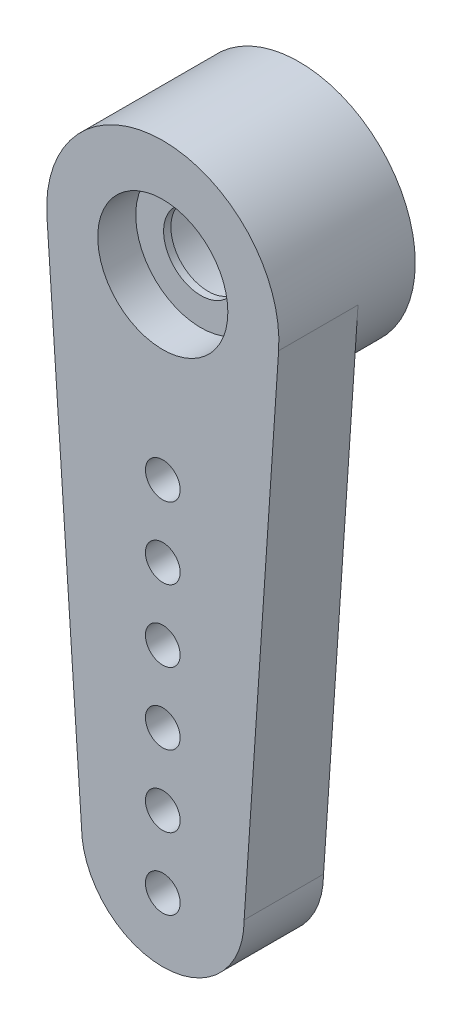
ISO-10303-21;
HEADER;
FILE_DESCRIPTION(('STEP AP214'),'2;1');
FILE_NAME('part.step','',(''),(''),'','','');
FILE_SCHEMA(('AUTOMOTIVE_DESIGN { 1 0 10303 214 1 1 1 1 }'));
ENDSEC;
DATA;
#1=APPLICATION_CONTEXT('core data for automotive mechanical design processes');
#2=APPLICATION_PROTOCOL_DEFINITION('international standard','automotive_design',2000,#1);
#3=PRODUCT_CONTEXT('',#1,'mechanical');
#4=PRODUCT('Part','Part','',(#3));
#5=PRODUCT_RELATED_PRODUCT_CATEGORY('part','',(#4));
#6=PRODUCT_DEFINITION_FORMATION('','',#4);
#7=PRODUCT_DEFINITION_CONTEXT('part definition',#1,'design');
#8=PRODUCT_DEFINITION('design','',#6,#7);
#9=PRODUCT_DEFINITION_SHAPE('','',#8);
#10=(LENGTH_UNIT() NAMED_UNIT(*) SI_UNIT(.MILLI.,.METRE.));
#11=(NAMED_UNIT(*) PLANE_ANGLE_UNIT() SI_UNIT($,.RADIAN.));
#12=(NAMED_UNIT(*) SI_UNIT($,.STERADIAN.) SOLID_ANGLE_UNIT());
#13=UNCERTAINTY_MEASURE_WITH_UNIT(LENGTH_MEASURE(1.E-05),#10,'distance_accuracy_value','');
#14=(GEOMETRIC_REPRESENTATION_CONTEXT(3) GLOBAL_UNCERTAINTY_ASSIGNED_CONTEXT((#13)) GLOBAL_UNIT_ASSIGNED_CONTEXT((#10,
#11,#12)) REPRESENTATION_CONTEXT('',''));
#15=CARTESIAN_POINT('',(0.,0.,0.));
#16=DIRECTION('',(0.,0.,1.));
#17=DIRECTION('',(1.,0.,0.));
#18=AXIS2_PLACEMENT_3D('',#15,#16,#17);
#19=CARTESIAN_POINT('',(0.,0.,-2.84196586235089));
#20=DIRECTION('',(0.,0.,-1.));
#21=DIRECTION('',(-1.,0.,0.));
#22=AXIS2_PLACEMENT_3D('',#19,#20,#21);
#23=CYLINDRICAL_SURFACE('',#22,3.5687);
#24=CARTESIAN_POINT('',(0.,0.,-7.03296586235089));
#25=DIRECTION('',(0.,0.,1.));
#26=DIRECTION('',(1.,0.,0.));
#27=AXIS2_PLACEMENT_3D('',#24,#25,#26);
#28=CIRCLE('',#27,3.5687);
#29=CARTESIAN_POINT('',(3.5687,0.,-7.03296586235089));
#30=VERTEX_POINT('',#29);
#31=EDGE_CURVE('E152',#30,#30,#28,.T.);
#32=ORIENTED_EDGE('',*,*,#31,.T.);
#33=EDGE_LOOP('',(#32));
#34=FACE_BOUND('',#33,.T.);
#35=DIRECTION('',(0.,0.,1.));
#36=VECTOR('',#35,1.);
#37=CARTESIAN_POINT('',(3.56,-0.249037527292574,-26.5595904714948));
#38=LINE('',#37,#36);
#39=CARTESIAN_POINT('',(3.56,-0.249037527292574,-5.28296586235089));
#40=VERTEX_POINT('',#39);
#41=CARTESIAN_POINT('',(3.56,-0.249037527292574,-2.84196586235089));
#42=VERTEX_POINT('',#41);
#43=EDGE_CURVE('E97',#40,#42,#38,.T.);
#44=ORIENTED_EDGE('',*,*,#43,.F.);
#45=CARTESIAN_POINT('',(0.,0.,-5.28296586235089));
#46=DIRECTION('',(0.,0.,1.));
#47=DIRECTION('',(1.,0.,0.));
#48=AXIS2_PLACEMENT_3D('',#45,#46,#47);
#49=CIRCLE('',#48,3.5687);
#50=CARTESIAN_POINT('',(-3.56,-0.249037527292576,-5.28296586235089));
#51=VERTEX_POINT('',#50);
#52=EDGE_CURVE('E61',#51,#40,#49,.T.);
#53=ORIENTED_EDGE('',*,*,#52,.F.);
#54=DIRECTION('',(0.,0.,1.));
#55=VECTOR('',#54,1.);
#56=CARTESIAN_POINT('',(-3.56,-0.249037527292576,-26.5595904714948));
#57=LINE('',#56,#55);
#58=CARTESIAN_POINT('',(-3.56,-0.249037527292576,-2.84196586235089));
#59=VERTEX_POINT('',#58);
#60=EDGE_CURVE('E123',#51,#59,#57,.T.);
#61=ORIENTED_EDGE('',*,*,#60,.T.);
#62=CARTESIAN_POINT('',(0.,0.,-2.84196586235089));
#63=DIRECTION('',(0.,0.,1.));
#64=DIRECTION('',(1.,0.,0.));
#65=AXIS2_PLACEMENT_3D('',#62,#63,#64);
#66=CIRCLE('',#65,3.5687);
#67=EDGE_CURVE('E54',#42,#59,#66,.T.);
#68=ORIENTED_EDGE('',*,*,#67,.F.);
#69=EDGE_LOOP('',(#44,#53,#61,#68));
#70=FACE_BOUND('',#69,.T.);
#71=ADVANCED_FACE('F46',(#34,#70),#23,.T.);
#72=CARTESIAN_POINT('',(0.,0.,-2.84196586235089));
#73=DIRECTION('',(0.,0.,-1.));
#74=DIRECTION('',(-1.,0.,0.));
#75=AXIS2_PLACEMENT_3D('',#72,#73,#74);
#76=CYLINDRICAL_SURFACE('',#75,2.);
#77=CARTESIAN_POINT('',(0.,0.,-7.03296586235089));
#78=DIRECTION('',(0.,0.,1.));
#79=DIRECTION('',(1.,0.,0.));
#80=AXIS2_PLACEMENT_3D('',#77,#78,#79);
#81=CIRCLE('',#80,2.);
#82=CARTESIAN_POINT('',(2.,0.,-7.03296586235089));
#83=VERTEX_POINT('',#82);
#84=EDGE_CURVE('E143',#83,#83,#81,.T.);
#85=ORIENTED_EDGE('',*,*,#84,.F.);
#86=EDGE_LOOP('',(#85));
#87=FACE_BOUND('',#86,.T.);
#88=CARTESIAN_POINT('',(0.,0.,-4.23296586235089));
#89=DIRECTION('',(0.,0.,1.));
#90=DIRECTION('',(1.,0.,0.));
#91=AXIS2_PLACEMENT_3D('',#88,#89,#90);
#92=CIRCLE('',#91,2.00000000000001);
#93=CARTESIAN_POINT('',(2.00000000000001,0.,-4.23296586235089));
#94=VERTEX_POINT('',#93);
#95=EDGE_CURVE('E138',#94,#94,#92,.T.);
#96=ORIENTED_EDGE('',*,*,#95,.T.);
#97=EDGE_LOOP('',(#96));
#98=FACE_BOUND('',#97,.T.);
#99=ADVANCED_FACE('F168',(#87,#98),#76,.F.);
#100=CARTESIAN_POINT('',(0.,0.,-2.84196586235089));
#101=DIRECTION('',(0.,0.,1.));
#102=DIRECTION('',(1.,0.,0.));
#103=AXIS2_PLACEMENT_3D('',#100,#101,#102);
#104=PLANE('',#103);
#105=ORIENTED_EDGE('',*,*,#67,.T.);
#106=DIRECTION('',(0.0674384099393954,-0.997723439067584,0.));
#107=VECTOR('',#106,1.);
#108=CARTESIAN_POINT('',(-2.5,-15.9313,-2.84196586235089));
#109=LINE('',#108,#107);
#110=CARTESIAN_POINT('',(-2.5,-15.9313,-2.84196586235089));
#111=VERTEX_POINT('',#110);
#112=EDGE_CURVE('E98',#59,#111,#109,.T.);
#113=ORIENTED_EDGE('',*,*,#112,.T.);
#114=CARTESIAN_POINT('',(0.,-15.9313,-2.84196586235089));
#115=DIRECTION('',(0.,0.,1.));
#116=DIRECTION('',(1.,0.,0.));
#117=AXIS2_PLACEMENT_3D('',#114,#115,#116);
#118=CIRCLE('',#117,2.5);
#119=CARTESIAN_POINT('',(2.5,-15.9313,-2.84196586235089));
#120=VERTEX_POINT('',#119);
#121=EDGE_CURVE('E91',#111,#120,#118,.T.);
#122=ORIENTED_EDGE('',*,*,#121,.T.);
#123=DIRECTION('',(0.0674384099393953,0.997723439067584,0.));
#124=VECTOR('',#123,1.);
#125=CARTESIAN_POINT('',(2.5,-15.9313,-2.84196586235089));
#126=LINE('',#125,#124);
#127=EDGE_CURVE('E101',#120,#42,#126,.T.);
#128=ORIENTED_EDGE('',*,*,#127,.T.);
#129=EDGE_LOOP('',(#105,#113,#122,#128));
#130=FACE_BOUND('',#129,.T.);
#131=CARTESIAN_POINT('',(0.,0.,-2.84196586235089));
#132=DIRECTION('',(0.,0.,1.));
#133=DIRECTION('',(1.,0.,0.));
#134=AXIS2_PLACEMENT_3D('',#131,#132,#133);
#135=CIRCLE('',#134,2.);
#136=CARTESIAN_POINT('',(2.,0.,-2.84196586235089));
#137=VERTEX_POINT('',#136);
#138=EDGE_CURVE('E148',#137,#137,#135,.T.);
#139=ORIENTED_EDGE('',*,*,#138,.F.);
#140=EDGE_LOOP('',(#139));
#141=FACE_BOUND('',#140,.T.);
#142=CARTESIAN_POINT('',(0.,-5.4647,-2.84196586235089));
#143=DIRECTION('',(0.,0.,1.));
#144=DIRECTION('',(1.,0.,0.));
#145=AXIS2_PLACEMENT_3D('',#142,#143,#144);
#146=CIRCLE('',#145,0.5334);
#147=CARTESIAN_POINT('',(0.533399999999999,-5.4647,-2.84196586235089));
#148=VERTEX_POINT('',#147);
#149=EDGE_CURVE('E201',#148,#148,#146,.T.);
#150=ORIENTED_EDGE('',*,*,#149,.F.);
#151=EDGE_LOOP('',(#150));
#152=FACE_BOUND('',#151,.T.);
#153=CARTESIAN_POINT('',(0.,-7.6647,-2.84196586235089));
#154=DIRECTION('',(0.,0.,1.));
#155=DIRECTION('',(1.,0.,0.));
#156=AXIS2_PLACEMENT_3D('',#153,#154,#155);
#157=CIRCLE('',#156,0.533399999999998);
#158=CARTESIAN_POINT('',(0.533399999999997,-7.6647,-2.84196586235089));
#159=VERTEX_POINT('',#158);
#160=EDGE_CURVE('E205',#159,#159,#157,.T.);
#161=ORIENTED_EDGE('',*,*,#160,.F.);
#162=EDGE_LOOP('',(#161));
#163=FACE_BOUND('',#162,.T.);
#164=CARTESIAN_POINT('',(0.,-9.8647,-2.84196586235089));
#165=DIRECTION('',(0.,0.,1.));
#166=DIRECTION('',(1.,0.,0.));
#167=AXIS2_PLACEMENT_3D('',#164,#165,#166);
#168=CIRCLE('',#167,0.533400000000001);
#169=CARTESIAN_POINT('',(0.533400000000001,-9.8647,-2.84196586235089));
#170=VERTEX_POINT('',#169);
#171=EDGE_CURVE('E209',#170,#170,#168,.T.);
#172=ORIENTED_EDGE('',*,*,#171,.F.);
#173=EDGE_LOOP('',(#172));
#174=FACE_BOUND('',#173,.T.);
#175=CARTESIAN_POINT('',(0.,-12.0647,-2.84196586235089));
#176=DIRECTION('',(0.,0.,1.));
#177=DIRECTION('',(1.,0.,0.));
#178=AXIS2_PLACEMENT_3D('',#175,#176,#177);
#179=CIRCLE('',#178,0.533400000000001);
#180=CARTESIAN_POINT('',(0.533400000000001,-12.0647,-2.84196586235089));
#181=VERTEX_POINT('',#180);
#182=EDGE_CURVE('E213',#181,#181,#179,.T.);
#183=ORIENTED_EDGE('',*,*,#182,.F.);
#184=EDGE_LOOP('',(#183));
#185=FACE_BOUND('',#184,.T.);
#186=CARTESIAN_POINT('',(0.,-14.2647,-2.84196586235089));
#187=DIRECTION('',(0.,0.,1.));
#188=DIRECTION('',(1.,0.,0.));
#189=AXIS2_PLACEMENT_3D('',#186,#187,#188);
#190=CIRCLE('',#189,0.533400000000001);
#191=CARTESIAN_POINT('',(0.533400000000002,-14.2647,-2.84196586235089));
#192=VERTEX_POINT('',#191);
#193=EDGE_CURVE('E114',#192,#192,#190,.T.);
#194=ORIENTED_EDGE('',*,*,#193,.F.);
#195=EDGE_LOOP('',(#194));
#196=FACE_BOUND('',#195,.T.);
#197=CARTESIAN_POINT('',(0.,-16.4647,-2.84196586235089));
#198=DIRECTION('',(0.,0.,1.));
#199=DIRECTION('',(1.,0.,0.));
#200=AXIS2_PLACEMENT_3D('',#197,#198,#199);
#201=CIRCLE('',#200,0.533400000000001);
#202=CARTESIAN_POINT('',(0.533400000000001,-16.4647,-2.84196586235089));
#203=VERTEX_POINT('',#202);
#204=EDGE_CURVE('E110',#203,#203,#201,.T.);
#205=ORIENTED_EDGE('',*,*,#204,.F.);
#206=EDGE_LOOP('',(#205));
#207=FACE_BOUND('',#206,.T.);
#208=ADVANCED_FACE('F106',(#130,#141,#152,#163,#174,#185,#196,#207),#104,.T.);
#209=CARTESIAN_POINT('',(0.,0.,-7.03296586235089));
#210=DIRECTION('',(0.,0.,1.));
#211=DIRECTION('',(1.,0.,0.));
#212=AXIS2_PLACEMENT_3D('',#209,#210,#211);
#213=PLANE('',#212);
#214=ORIENTED_EDGE('',*,*,#31,.F.);
#215=EDGE_LOOP('',(#214));
#216=FACE_BOUND('',#215,.T.);
#217=ORIENTED_EDGE('',*,*,#84,.T.);
#218=EDGE_LOOP('',(#217));
#219=FACE_BOUND('',#218,.T.);
#220=ADVANCED_FACE('F162',(#216,#219),#213,.F.);
#221=CARTESIAN_POINT('',(0.,0.,-4.01036586235089));
#222=DIRECTION('',(0.,0.,1.));
#223=DIRECTION('',(1.,0.,0.));
#224=AXIS2_PLACEMENT_3D('',#221,#222,#223);
#225=CIRCLE('',#224,2.);
#226=CARTESIAN_POINT('',(2.,0.,-4.01036586235089));
#227=VERTEX_POINT('',#226);
#228=EDGE_CURVE('E12',#227,#227,#225,.T.);
#229=ORIENTED_EDGE('',*,*,#228,.F.);
#230=EDGE_LOOP('',(#229));
#231=FACE_BOUND('',#230,.T.);
#232=ORIENTED_EDGE('',*,*,#138,.T.);
#233=EDGE_LOOP('',(#232));
#234=FACE_BOUND('',#233,.T.);
#235=ADVANCED_FACE('F165',(#231,#234),#76,.F.);
#236=CARTESIAN_POINT('',(0.,0.,-4.23296586235089));
#237=DIRECTION('',(0.,0.,1.));
#238=DIRECTION('',(1.,0.,0.));
#239=AXIS2_PLACEMENT_3D('',#236,#237,#238);
#240=PLANE('',#239);
#241=ORIENTED_EDGE('',*,*,#95,.F.);
#242=EDGE_LOOP('',(#241));
#243=FACE_BOUND('',#242,.T.);
#244=CARTESIAN_POINT('',(0.,0.,-4.23296586235089));
#245=DIRECTION('',(0.,0.,1.));
#246=DIRECTION('',(1.,0.,0.));
#247=AXIS2_PLACEMENT_3D('',#244,#245,#246);
#248=CIRCLE('',#247,1.14300000000001);
#249=CARTESIAN_POINT('',(1.14300000000001,0.,-4.23296586235089));
#250=VERTEX_POINT('',#249);
#251=EDGE_CURVE('E134',#250,#250,#248,.T.);
#252=ORIENTED_EDGE('',*,*,#251,.T.);
#253=EDGE_LOOP('',(#252));
#254=FACE_BOUND('',#253,.T.);
#255=ADVANCED_FACE('F174',(#243,#254),#240,.F.);
#256=CARTESIAN_POINT('',(0.,0.,2.81488838714151));
#257=DIRECTION('',(0.,0.,-1.));
#258=DIRECTION('',(-1.,0.,0.));
#259=AXIS2_PLACEMENT_3D('',#256,#257,#258);
#260=CYLINDRICAL_SURFACE('',#259,1.14300000000001);
#261=ORIENTED_EDGE('',*,*,#251,.F.);
#262=EDGE_LOOP('',(#261));
#263=FACE_BOUND('',#262,.T.);
#264=CARTESIAN_POINT('',(0.,0.,-4.01036586235089));
#265=DIRECTION('',(0.,0.,1.));
#266=DIRECTION('',(1.,0.,0.));
#267=AXIS2_PLACEMENT_3D('',#264,#265,#266);
#268=CIRCLE('',#267,1.14300000000001);
#269=CARTESIAN_POINT('',(1.14300000000001,0.,-4.01036586235089));
#270=VERTEX_POINT('',#269);
#271=EDGE_CURVE('E139',#270,#270,#268,.T.);
#272=ORIENTED_EDGE('',*,*,#271,.T.);
#273=EDGE_LOOP('',(#272));
#274=FACE_BOUND('',#273,.T.);
#275=ADVANCED_FACE('F177',(#263,#274),#260,.F.);
#276=CARTESIAN_POINT('',(0.,0.,-4.01036586235089));
#277=DIRECTION('',(0.,0.,1.));
#278=DIRECTION('',(1.,0.,0.));
#279=AXIS2_PLACEMENT_3D('',#276,#277,#278);
#280=PLANE('',#279);
#281=ORIENTED_EDGE('',*,*,#271,.F.);
#282=EDGE_LOOP('',(#281));
#283=FACE_BOUND('',#282,.T.);
#284=ORIENTED_EDGE('',*,*,#228,.T.);
#285=EDGE_LOOP('',(#284));
#286=FACE_BOUND('',#285,.T.);
#287=ADVANCED_FACE('F183',(#283,#286),#280,.T.);
#288=CARTESIAN_POINT('',(2.5,-15.9313,-26.5595904714948));
#289=DIRECTION('',(0.997723439067584,-0.0674384099393953,0.));
#290=DIRECTION('',(0.0674384099393953,0.997723439067584,0.));
#291=AXIS2_PLACEMENT_3D('',#288,#289,#290);
#292=PLANE('',#291);
#293=DIRECTION('',(-0.0674384099393953,-0.997723439067584,0.));
#294=VECTOR('',#293,1.);
#295=CARTESIAN_POINT('',(2.5,-15.9313,-5.28296586235089));
#296=LINE('',#295,#294);
#297=CARTESIAN_POINT('',(2.5,-15.9313,-5.28296586235089));
#298=VERTEX_POINT('',#297);
#299=EDGE_CURVE('E352',#40,#298,#296,.T.);
#300=ORIENTED_EDGE('',*,*,#299,.F.);
#301=ORIENTED_EDGE('',*,*,#43,.T.);
#302=ORIENTED_EDGE('',*,*,#127,.F.);
#303=DIRECTION('',(0.,0.,1.));
#304=VECTOR('',#303,1.);
#305=CARTESIAN_POINT('',(2.5,-15.9313,-26.5595904714948));
#306=LINE('',#305,#304);
#307=EDGE_CURVE('E86',#298,#120,#306,.T.);
#308=ORIENTED_EDGE('',*,*,#307,.F.);
#309=EDGE_LOOP('',(#300,#301,#302,#308));
#310=FACE_BOUND('',#309,.T.);
#311=ADVANCED_FACE('F102',(#310),#292,.T.);
#312=CARTESIAN_POINT('',(-2.5,-15.9313,-26.5595904714948));
#313=DIRECTION('',(-0.997723439067584,-0.0674384099393954,0.));
#314=DIRECTION('',(0.0674384099393954,-0.997723439067584,0.));
#315=AXIS2_PLACEMENT_3D('',#312,#313,#314);
#316=PLANE('',#315);
#317=DIRECTION('',(-0.0674384099393954,0.997723439067584,0.));
#318=VECTOR('',#317,1.);
#319=CARTESIAN_POINT('',(-2.5,-15.9313,-5.28296586235089));
#320=LINE('',#319,#318);
#321=CARTESIAN_POINT('',(-2.5,-15.9313,-5.28296586235089));
#322=VERTEX_POINT('',#321);
#323=EDGE_CURVE('E357',#322,#51,#320,.T.);
#324=ORIENTED_EDGE('',*,*,#323,.F.);
#325=DIRECTION('',(0.,0.,1.));
#326=VECTOR('',#325,1.);
#327=CARTESIAN_POINT('',(-2.5,-15.9313,-26.5595904714948));
#328=LINE('',#327,#326);
#329=EDGE_CURVE('E120',#322,#111,#328,.T.);
#330=ORIENTED_EDGE('',*,*,#329,.T.);
#331=ORIENTED_EDGE('',*,*,#112,.F.);
#332=ORIENTED_EDGE('',*,*,#60,.F.);
#333=EDGE_LOOP('',(#324,#330,#331,#332));
#334=FACE_BOUND('',#333,.T.);
#335=ADVANCED_FACE('F231',(#334),#316,.T.);
#336=CARTESIAN_POINT('',(0.,-15.9313,-26.5595904714948));
#337=DIRECTION('',(0.,0.,1.));
#338=DIRECTION('',(1.,0.,0.));
#339=AXIS2_PLACEMENT_3D('',#336,#337,#338);
#340=CYLINDRICAL_SURFACE('',#339,2.5);
#341=CARTESIAN_POINT('',(0.,-15.9313,-5.28296586235089));
#342=DIRECTION('',(0.,0.,1.));
#343=DIRECTION('',(1.,0.,0.));
#344=AXIS2_PLACEMENT_3D('',#341,#342,#343);
#345=CIRCLE('',#344,2.5);
#346=EDGE_CURVE('E93',#298,#322,#345,.F.);
#347=ORIENTED_EDGE('',*,*,#346,.F.);
#348=ORIENTED_EDGE('',*,*,#307,.T.);
#349=ORIENTED_EDGE('',*,*,#121,.F.);
#350=ORIENTED_EDGE('',*,*,#329,.F.);
#351=EDGE_LOOP('',(#347,#348,#349,#350));
#352=FACE_BOUND('',#351,.T.);
#353=ADVANCED_FACE('F88',(#352),#340,.T.);
#354=CARTESIAN_POINT('',(0.,-16.4647,-26.5595904714948));
#355=DIRECTION('',(0.,0.,1.));
#356=DIRECTION('',(1.,0.,0.));
#357=AXIS2_PLACEMENT_3D('',#354,#355,#356);
#358=CYLINDRICAL_SURFACE('',#357,0.533400000000001);
#359=CARTESIAN_POINT('',(0.,-16.4647,-5.28296586235089));
#360=DIRECTION('',(0.,0.,1.));
#361=DIRECTION('',(1.,0.,0.));
#362=AXIS2_PLACEMENT_3D('',#359,#360,#361);
#363=CIRCLE('',#362,0.533400000000001);
#364=CARTESIAN_POINT('',(0.533400000000001,-16.4647,-5.28296586235089));
#365=VERTEX_POINT('',#364);
#366=EDGE_CURVE('E147',#365,#365,#363,.F.);
#367=ORIENTED_EDGE('',*,*,#366,.T.);
#368=EDGE_LOOP('',(#367));
#369=FACE_BOUND('',#368,.T.);
#370=ORIENTED_EDGE('',*,*,#204,.T.);
#371=EDGE_LOOP('',(#370));
#372=FACE_BOUND('',#371,.T.);
#373=ADVANCED_FACE('F219',(#369,#372),#358,.F.);
#374=CARTESIAN_POINT('',(0.,-14.2647,-26.5595904714948));
#375=DIRECTION('',(0.,0.,1.));
#376=DIRECTION('',(1.,0.,0.));
#377=AXIS2_PLACEMENT_3D('',#374,#375,#376);
#378=CYLINDRICAL_SURFACE('',#377,0.533400000000001);
#379=CARTESIAN_POINT('',(0.,-14.2647,-5.28296586235089));
#380=DIRECTION('',(0.,0.,1.));
#381=DIRECTION('',(1.,0.,0.));
#382=AXIS2_PLACEMENT_3D('',#379,#380,#381);
#383=CIRCLE('',#382,0.533400000000001);
#384=CARTESIAN_POINT('',(0.533400000000002,-14.2647,-5.28296586235089));
#385=VERTEX_POINT('',#384);
#386=EDGE_CURVE('E332',#385,#385,#383,.F.);
#387=ORIENTED_EDGE('',*,*,#386,.T.);
#388=EDGE_LOOP('',(#387));
#389=FACE_BOUND('',#388,.T.);
#390=ORIENTED_EDGE('',*,*,#193,.T.);
#391=EDGE_LOOP('',(#390));
#392=FACE_BOUND('',#391,.T.);
#393=ADVANCED_FACE('F221',(#389,#392),#378,.F.);
#394=CARTESIAN_POINT('',(0.,-12.0647,-26.5595904714948));
#395=DIRECTION('',(0.,0.,1.));
#396=DIRECTION('',(1.,0.,0.));
#397=AXIS2_PLACEMENT_3D('',#394,#395,#396);
#398=CYLINDRICAL_SURFACE('',#397,0.533400000000001);
#399=CARTESIAN_POINT('',(0.,-12.0647,-5.28296586235089));
#400=DIRECTION('',(0.,0.,1.));
#401=DIRECTION('',(1.,0.,0.));
#402=AXIS2_PLACEMENT_3D('',#399,#400,#401);
#403=CIRCLE('',#402,0.533400000000001);
#404=CARTESIAN_POINT('',(0.533400000000001,-12.0647,-5.28296586235089));
#405=VERTEX_POINT('',#404);
#406=EDGE_CURVE('E344',#405,#405,#403,.F.);
#407=ORIENTED_EDGE('',*,*,#406,.T.);
#408=EDGE_LOOP('',(#407));
#409=FACE_BOUND('',#408,.T.);
#410=ORIENTED_EDGE('',*,*,#182,.T.);
#411=EDGE_LOOP('',(#410));
#412=FACE_BOUND('',#411,.T.);
#413=ADVANCED_FACE('F228',(#409,#412),#398,.F.);
#414=CARTESIAN_POINT('',(0.,-9.8647,-26.5595904714948));
#415=DIRECTION('',(0.,0.,1.));
#416=DIRECTION('',(1.,0.,0.));
#417=AXIS2_PLACEMENT_3D('',#414,#415,#416);
#418=CYLINDRICAL_SURFACE('',#417,0.533400000000001);
#419=CARTESIAN_POINT('',(0.,-9.8647,-5.28296586235089));
#420=DIRECTION('',(0.,0.,1.));
#421=DIRECTION('',(1.,0.,0.));
#422=AXIS2_PLACEMENT_3D('',#419,#420,#421);
#423=CIRCLE('',#422,0.533400000000001);
#424=CARTESIAN_POINT('',(0.533400000000001,-9.8647,-5.28296586235089));
#425=VERTEX_POINT('',#424);
#426=EDGE_CURVE('E133',#425,#425,#423,.F.);
#427=ORIENTED_EDGE('',*,*,#426,.T.);
#428=EDGE_LOOP('',(#427));
#429=FACE_BOUND('',#428,.T.);
#430=ORIENTED_EDGE('',*,*,#171,.T.);
#431=EDGE_LOOP('',(#430));
#432=FACE_BOUND('',#431,.T.);
#433=ADVANCED_FACE('F284',(#429,#432),#418,.F.);
#434=CARTESIAN_POINT('',(0.,-7.6647,-26.5595904714948));
#435=DIRECTION('',(0.,0.,1.));
#436=DIRECTION('',(1.,0.,0.));
#437=AXIS2_PLACEMENT_3D('',#434,#435,#436);
#438=CYLINDRICAL_SURFACE('',#437,0.533399999999998);
#439=CARTESIAN_POINT('',(0.,-7.6647,-5.28296586235089));
#440=DIRECTION('',(0.,0.,1.));
#441=DIRECTION('',(1.,0.,0.));
#442=AXIS2_PLACEMENT_3D('',#439,#440,#441);
#443=CIRCLE('',#442,0.533399999999998);
#444=CARTESIAN_POINT('',(0.533399999999997,-7.6647,-5.28296586235089));
#445=VERTEX_POINT('',#444);
#446=EDGE_CURVE('E132',#445,#445,#443,.F.);
#447=ORIENTED_EDGE('',*,*,#446,.T.);
#448=EDGE_LOOP('',(#447));
#449=FACE_BOUND('',#448,.T.);
#450=ORIENTED_EDGE('',*,*,#160,.T.);
#451=EDGE_LOOP('',(#450));
#452=FACE_BOUND('',#451,.T.);
#453=ADVANCED_FACE('F294',(#449,#452),#438,.F.);
#454=CARTESIAN_POINT('',(0.,-5.4647,-26.5595904714948));
#455=DIRECTION('',(0.,0.,1.));
#456=DIRECTION('',(1.,0.,0.));
#457=AXIS2_PLACEMENT_3D('',#454,#455,#456);
#458=CYLINDRICAL_SURFACE('',#457,0.5334);
#459=CARTESIAN_POINT('',(0.,-5.4647,-5.28296586235089));
#460=DIRECTION('',(0.,0.,1.));
#461=DIRECTION('',(1.,0.,0.));
#462=AXIS2_PLACEMENT_3D('',#459,#460,#461);
#463=CIRCLE('',#462,0.5334);
#464=CARTESIAN_POINT('',(0.533399999999999,-5.4647,-5.28296586235089));
#465=VERTEX_POINT('',#464);
#466=EDGE_CURVE('E128',#465,#465,#463,.F.);
#467=ORIENTED_EDGE('',*,*,#466,.T.);
#468=EDGE_LOOP('',(#467));
#469=FACE_BOUND('',#468,.T.);
#470=ORIENTED_EDGE('',*,*,#149,.T.);
#471=EDGE_LOOP('',(#470));
#472=FACE_BOUND('',#471,.T.);
#473=ADVANCED_FACE('F304',(#469,#472),#458,.F.);
#474=CARTESIAN_POINT('',(0.,0.,-5.28296586235089));
#475=DIRECTION('',(0.,0.,1.));
#476=DIRECTION('',(1.,0.,0.));
#477=AXIS2_PLACEMENT_3D('',#474,#475,#476);
#478=PLANE('',#477);
#479=ORIENTED_EDGE('',*,*,#346,.T.);
#480=ORIENTED_EDGE('',*,*,#323,.T.);
#481=ORIENTED_EDGE('',*,*,#52,.T.);
#482=ORIENTED_EDGE('',*,*,#299,.T.);
#483=EDGE_LOOP('',(#479,#480,#481,#482));
#484=FACE_BOUND('',#483,.T.);
#485=ORIENTED_EDGE('',*,*,#386,.F.);
#486=EDGE_LOOP('',(#485));
#487=FACE_BOUND('',#486,.T.);
#488=ORIENTED_EDGE('',*,*,#426,.F.);
#489=EDGE_LOOP('',(#488));
#490=FACE_BOUND('',#489,.T.);
#491=ORIENTED_EDGE('',*,*,#466,.F.);
#492=EDGE_LOOP('',(#491));
#493=FACE_BOUND('',#492,.T.);
#494=ORIENTED_EDGE('',*,*,#446,.F.);
#495=EDGE_LOOP('',(#494));
#496=FACE_BOUND('',#495,.T.);
#497=ORIENTED_EDGE('',*,*,#406,.F.);
#498=EDGE_LOOP('',(#497));
#499=FACE_BOUND('',#498,.T.);
#500=ORIENTED_EDGE('',*,*,#366,.F.);
#501=EDGE_LOOP('',(#500));
#502=FACE_BOUND('',#501,.T.);
#503=ADVANCED_FACE('F314',(#484,#487,#490,#493,#496,#499,#502),#478,.F.);
#504=CLOSED_SHELL('',(#71,#99,#208,#220,#235,#255,#275,#287,#311,#335,#353,#373,#393,#413,#433,
#453,#473,#503));
#505=MANIFOLD_SOLID_BREP('B2',#504);
#506=ADVANCED_BREP_SHAPE_REPRESENTATION('',(#18,#505),#14);
#507=SHAPE_DEFINITION_REPRESENTATION(#9,#506);
ENDSEC;
END-ISO-10303-21;
